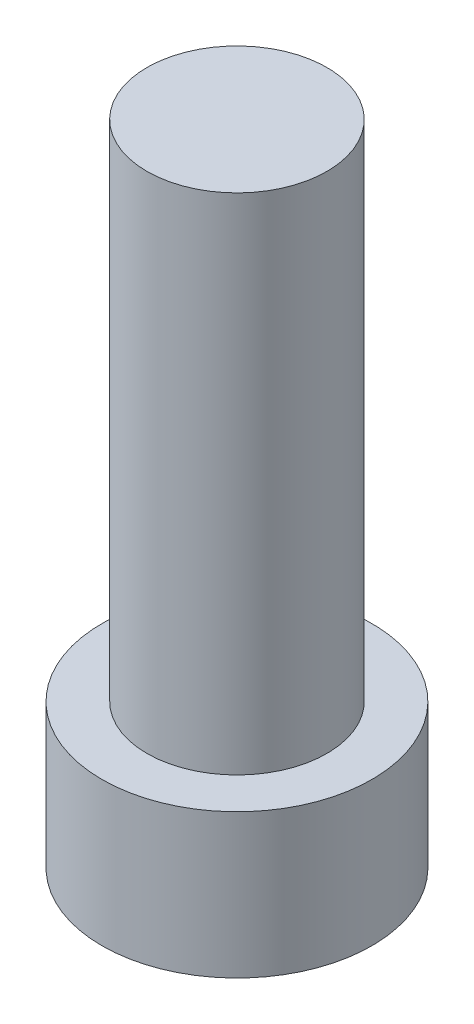
ISO-10303-21;
HEADER;
FILE_DESCRIPTION(('STEP AP214'),'2;1');
FILE_NAME('part.step','',(''),(''),'','','');
FILE_SCHEMA(('AUTOMOTIVE_DESIGN { 1 0 10303 214 1 1 1 1 }'));
ENDSEC;
DATA;
#1=APPLICATION_CONTEXT('core data for automotive mechanical design processes');
#2=APPLICATION_PROTOCOL_DEFINITION('international standard','automotive_design',2000,#1);
#3=PRODUCT_CONTEXT('',#1,'mechanical');
#4=PRODUCT('Part','Part','',(#3));
#5=PRODUCT_RELATED_PRODUCT_CATEGORY('part','',(#4));
#6=PRODUCT_DEFINITION_FORMATION('','',#4);
#7=PRODUCT_DEFINITION_CONTEXT('part definition',#1,'design');
#8=PRODUCT_DEFINITION('design','',#6,#7);
#9=PRODUCT_DEFINITION_SHAPE('','',#8);
#10=(LENGTH_UNIT() NAMED_UNIT(*) SI_UNIT(.MILLI.,.METRE.));
#11=(NAMED_UNIT(*) PLANE_ANGLE_UNIT() SI_UNIT($,.RADIAN.));
#12=(NAMED_UNIT(*) SI_UNIT($,.STERADIAN.) SOLID_ANGLE_UNIT());
#13=UNCERTAINTY_MEASURE_WITH_UNIT(LENGTH_MEASURE(1.E-05),#10,'distance_accuracy_value','');
#14=(GEOMETRIC_REPRESENTATION_CONTEXT(3) GLOBAL_UNCERTAINTY_ASSIGNED_CONTEXT((#13)) GLOBAL_UNIT_ASSIGNED_CONTEXT((#10,
#11,#12)) REPRESENTATION_CONTEXT('',''));
#15=CARTESIAN_POINT('',(0.,0.,0.));
#16=DIRECTION('',(0.,0.,1.));
#17=DIRECTION('',(1.,0.,0.));
#18=AXIS2_PLACEMENT_3D('',#15,#16,#17);
#19=CARTESIAN_POINT('',(0.,4.,0.));
#20=DIRECTION('',(0.,-1.,0.));
#21=DIRECTION('',(0.,0.,-1.));
#22=AXIS2_PLACEMENT_3D('',#19,#20,#21);
#23=CYLINDRICAL_SURFACE('',#22,3.75);
#24=CARTESIAN_POINT('',(0.,4.,0.));
#25=DIRECTION('',(0.,1.,0.));
#26=DIRECTION('',(0.,0.,1.));
#27=AXIS2_PLACEMENT_3D('',#24,#25,#26);
#28=CIRCLE('',#27,3.75);
#29=CARTESIAN_POINT('',(0.,4.,3.75));
#30=VERTEX_POINT('',#29);
#31=EDGE_CURVE('E161',#30,#30,#28,.T.);
#32=ORIENTED_EDGE('',*,*,#31,.F.);
#33=EDGE_LOOP('',(#32));
#34=FACE_BOUND('',#33,.T.);
#35=CARTESIAN_POINT('',(0.,0.,0.));
#36=DIRECTION('',(0.,1.,0.));
#37=DIRECTION('',(0.,0.,1.));
#38=AXIS2_PLACEMENT_3D('',#35,#36,#37);
#39=CIRCLE('',#38,3.75);
#40=CARTESIAN_POINT('',(0.,0.,3.75));
#41=VERTEX_POINT('',#40);
#42=EDGE_CURVE('E156',#41,#41,#39,.T.);
#43=ORIENTED_EDGE('',*,*,#42,.T.);
#44=EDGE_LOOP('',(#43));
#45=FACE_BOUND('',#44,.T.);
#46=ADVANCED_FACE('F39',(#34,#45),#23,.T.);
#47=CARTESIAN_POINT('',(0.,4.,0.));
#48=DIRECTION('',(0.,1.,0.));
#49=DIRECTION('',(0.,0.,1.));
#50=AXIS2_PLACEMENT_3D('',#47,#48,#49);
#51=PLANE('',#50);
#52=CARTESIAN_POINT('',(0.,4.,0.));
#53=DIRECTION('',(0.,1.,0.));
#54=DIRECTION('',(0.,0.,1.));
#55=AXIS2_PLACEMENT_3D('',#52,#53,#54);
#56=CIRCLE('',#55,2.5);
#57=CARTESIAN_POINT('',(0.,4.,2.5));
#58=VERTEX_POINT('',#57);
#59=EDGE_CURVE('E157',#58,#58,#56,.T.);
#60=ORIENTED_EDGE('',*,*,#59,.F.);
#61=EDGE_LOOP('',(#60));
#62=FACE_BOUND('',#61,.T.);
#63=ORIENTED_EDGE('',*,*,#31,.T.);
#64=EDGE_LOOP('',(#63));
#65=FACE_BOUND('',#64,.T.);
#66=ADVANCED_FACE('F244',(#62,#65),#51,.T.);
#67=CARTESIAN_POINT('',(0.,0.,0.));
#68=DIRECTION('',(0.,1.,0.));
#69=DIRECTION('',(0.,0.,1.));
#70=AXIS2_PLACEMENT_3D('',#67,#68,#69);
#71=PLANE('',#70);
#72=DIRECTION('',(0.999992303846242,0.,0.00392329558971804));
#73=VECTOR('',#72,1.);
#74=CARTESIAN_POINT('',(0.00888657905015013,0.,-2.26506273984572));
#75=LINE('',#74,#73);
#76=CARTESIAN_POINT('',(1.31662116163147,0.,-2.25993207103894));
#77=VERTEX_POINT('',#76);
#78=CARTESIAN_POINT('',(-1.29884800353117,0.,-2.2701934086525));
#79=VERTEX_POINT('',#78);
#80=EDGE_CURVE('E176',#77,#79,#75,.F.);
#81=ORIENTED_EDGE('',*,*,#80,.T.);
#82=DIRECTION('',(0.503393825570373,0.,-0.864057090924914));
#83=VECTOR('',#82,1.);
#84=CARTESIAN_POINT('',(-1.9571585843469,0.,-1.14022737313303));
#85=LINE('',#84,#83);
#86=CARTESIAN_POINT('',(-2.61546916516264,0.,-0.0102613376135585));
#87=VERTEX_POINT('',#86);
#88=EDGE_CURVE('E178',#79,#87,#85,.F.);
#89=ORIENTED_EDGE('',*,*,#88,.T.);
#90=DIRECTION('',(-0.49659847827587,0.,-0.867980386514632));
#91=VECTOR('',#90,1.);
#92=CARTESIAN_POINT('',(-1.96604516339705,0.,1.12483536671269));
#93=LINE('',#92,#91);
#94=CARTESIAN_POINT('',(-1.31662116163147,0.,2.25993207103894));
#95=VERTEX_POINT('',#94);
#96=EDGE_CURVE('E170',#87,#95,#93,.F.);
#97=ORIENTED_EDGE('',*,*,#96,.T.);
#98=DIRECTION('',(-0.999992303846242,0.,-0.00392329558971804));
#99=VECTOR('',#98,1.);
#100=CARTESIAN_POINT('',(-0.00888657905015013,0.,2.26506273984572));
#101=LINE('',#100,#99);
#102=CARTESIAN_POINT('',(1.29884800353117,0.,2.2701934086525));
#103=VERTEX_POINT('',#102);
#104=EDGE_CURVE('E168',#95,#103,#101,.F.);
#105=ORIENTED_EDGE('',*,*,#104,.T.);
#106=DIRECTION('',(-0.503393825570373,0.,0.864057090924914));
#107=VECTOR('',#106,1.);
#108=CARTESIAN_POINT('',(1.9571585843469,0.,1.14022737313303));
#109=LINE('',#108,#107);
#110=CARTESIAN_POINT('',(2.61546916516264,0.,0.0102613376135581));
#111=VERTEX_POINT('',#110);
#112=EDGE_CURVE('E172',#103,#111,#109,.F.);
#113=ORIENTED_EDGE('',*,*,#112,.T.);
#114=DIRECTION('',(0.49659847827587,0.,0.867980386514632));
#115=VECTOR('',#114,1.);
#116=CARTESIAN_POINT('',(1.96604516339705,0.,-1.12483536671269));
#117=LINE('',#116,#115);
#118=EDGE_CURVE('E174',#111,#77,#117,.F.);
#119=ORIENTED_EDGE('',*,*,#118,.T.);
#120=EDGE_LOOP('',(#81,#89,#97,#105,#113,#119));
#121=FACE_BOUND('',#120,.T.);
#122=ORIENTED_EDGE('',*,*,#42,.F.);
#123=EDGE_LOOP('',(#122));
#124=FACE_BOUND('',#123,.T.);
#125=ADVANCED_FACE('F232',(#121,#124),#71,.F.);
#126=CARTESIAN_POINT('',(0.,18.,0.));
#127=DIRECTION('',(0.,-1.,0.));
#128=DIRECTION('',(0.,0.,-1.));
#129=AXIS2_PLACEMENT_3D('',#126,#127,#128);
#130=CYLINDRICAL_SURFACE('',#129,2.5);
#131=CARTESIAN_POINT('',(0.,18.,0.));
#132=DIRECTION('',(0.,1.,0.));
#133=DIRECTION('',(0.,0.,1.));
#134=AXIS2_PLACEMENT_3D('',#131,#132,#133);
#135=CIRCLE('',#134,2.5);
#136=CARTESIAN_POINT('',(0.,18.,2.5));
#137=VERTEX_POINT('',#136);
#138=EDGE_CURVE('E143',#137,#137,#135,.T.);
#139=ORIENTED_EDGE('',*,*,#138,.F.);
#140=EDGE_LOOP('',(#139));
#141=FACE_BOUND('',#140,.T.);
#142=ORIENTED_EDGE('',*,*,#59,.T.);
#143=EDGE_LOOP('',(#142));
#144=FACE_BOUND('',#143,.T.);
#145=ADVANCED_FACE('F255',(#141,#144),#130,.T.);
#146=CARTESIAN_POINT('',(0.,18.,0.));
#147=DIRECTION('',(0.,1.,0.));
#148=DIRECTION('',(0.,0.,1.));
#149=AXIS2_PLACEMENT_3D('',#146,#147,#148);
#150=PLANE('',#149);
#151=ORIENTED_EDGE('',*,*,#138,.T.);
#152=EDGE_LOOP('',(#151));
#153=FACE_BOUND('',#152,.T.);
#154=ADVANCED_FACE('F259',(#153),#150,.T.);
#155=CARTESIAN_POINT('',(2.5,2.5,0.00980831446059129));
#156=DIRECTION('',(0.864057090924914,0.,0.503393825570373));
#157=DIRECTION('',(0.503393825570373,0.,-0.864057090924914));
#158=AXIS2_PLACEMENT_3D('',#155,#156,#157);
#159=PLANE('',#158);
#160=DIRECTION('',(0.,-1.,0.));
#161=VECTOR('',#160,1.);
#162=CARTESIAN_POINT('',(2.5,2.5,0.00980831446059129));
#163=LINE('',#162,#161);
#164=CARTESIAN_POINT('',(2.5,2.5,0.00980831446059129));
#165=VERTEX_POINT('',#164);
#166=CARTESIAN_POINT('',(2.5,0.0999999999999998,0.00980831446059129));
#167=VERTEX_POINT('',#166);
#168=EDGE_CURVE('E141',#165,#167,#163,.T.);
#169=ORIENTED_EDGE('',*,*,#168,.T.);
#170=DIRECTION('',(-0.503393825570373,0.,0.864057090924914));
#171=VECTOR('',#170,1.);
#172=CARTESIAN_POINT('',(2.5,0.0999999999999998,0.00980831446059129));
#173=LINE('',#172,#171);
#174=CARTESIAN_POINT('',(1.24150575050882,0.0999999999999998,2.16996766669139));
#175=VERTEX_POINT('',#174);
#176=EDGE_CURVE('E62',#167,#175,#173,.T.);
#177=ORIENTED_EDGE('',*,*,#176,.T.);
#178=DIRECTION('',(0.,-1.,0.));
#179=VECTOR('',#178,1.);
#180=CARTESIAN_POINT('',(1.24150575050882,2.5,2.16996766669139));
#181=LINE('',#180,#179);
#182=CARTESIAN_POINT('',(1.24150575050882,2.5,2.16996766669139));
#183=VERTEX_POINT('',#182);
#184=EDGE_CURVE('E109',#183,#175,#181,.T.);
#185=ORIENTED_EDGE('',*,*,#184,.F.);
#186=DIRECTION('',(-0.503393825570373,0.,0.864057090924914));
#187=VECTOR('',#186,1.);
#188=CARTESIAN_POINT('',(2.5,2.5,0.00980831446059129));
#189=LINE('',#188,#187);
#190=EDGE_CURVE('E113',#165,#183,#189,.T.);
#191=ORIENTED_EDGE('',*,*,#190,.F.);
#192=EDGE_LOOP('',(#169,#177,#185,#191));
#193=FACE_BOUND('',#192,.T.);
#194=ADVANCED_FACE('F111',(#193),#159,.F.);
#195=CARTESIAN_POINT('',(1.25849424949118,2.5,-2.1601593522308));
#196=DIRECTION('',(0.867980386514632,0.,-0.49659847827587));
#197=DIRECTION('',(-0.49659847827587,0.,-0.867980386514632));
#198=AXIS2_PLACEMENT_3D('',#195,#196,#197);
#199=PLANE('',#198);
#200=DIRECTION('',(0.,-1.,0.));
#201=VECTOR('',#200,1.);
#202=CARTESIAN_POINT('',(1.25849424949118,2.5,-2.1601593522308));
#203=LINE('',#202,#201);
#204=CARTESIAN_POINT('',(1.25849424949118,2.5,-2.1601593522308));
#205=VERTEX_POINT('',#204);
#206=CARTESIAN_POINT('',(1.25849424949118,0.0999999999999998,-2.1601593522308));
#207=VERTEX_POINT('',#206);
#208=EDGE_CURVE('E144',#205,#207,#203,.T.);
#209=ORIENTED_EDGE('',*,*,#208,.T.);
#210=DIRECTION('',(0.49659847827587,0.,0.867980386514632));
#211=VECTOR('',#210,1.);
#212=CARTESIAN_POINT('',(1.25849424949118,0.0999999999999998,-2.1601593522308));
#213=LINE('',#212,#211);
#214=EDGE_CURVE('E183',#207,#167,#213,.T.);
#215=ORIENTED_EDGE('',*,*,#214,.T.);
#216=ORIENTED_EDGE('',*,*,#168,.F.);
#217=DIRECTION('',(0.49659847827587,0.,0.867980386514632));
#218=VECTOR('',#217,1.);
#219=CARTESIAN_POINT('',(1.25849424949118,2.5,-2.1601593522308));
#220=LINE('',#219,#218);
#221=EDGE_CURVE('E117',#205,#165,#220,.T.);
#222=ORIENTED_EDGE('',*,*,#221,.F.);
#223=EDGE_LOOP('',(#209,#215,#216,#222));
#224=FACE_BOUND('',#223,.T.);
#225=ADVANCED_FACE('F223',(#224),#199,.F.);
#226=CARTESIAN_POINT('',(-1.24150575050882,2.5,-2.16996766669139));
#227=DIRECTION('',(0.00392329558971804,0.,-0.999992303846242));
#228=DIRECTION('',(-0.999992303846242,0.,-0.00392329558971804));
#229=AXIS2_PLACEMENT_3D('',#226,#227,#228);
#230=PLANE('',#229);
#231=DIRECTION('',(0.,-1.,0.));
#232=VECTOR('',#231,1.);
#233=CARTESIAN_POINT('',(-1.24150575050882,2.5,-2.16996766669139));
#234=LINE('',#233,#232);
#235=CARTESIAN_POINT('',(-1.24150575050882,2.5,-2.16996766669139));
#236=VERTEX_POINT('',#235);
#237=CARTESIAN_POINT('',(-1.24150575050882,0.0999999999999998,-2.16996766669139));
#238=VERTEX_POINT('',#237);
#239=EDGE_CURVE('E147',#236,#238,#234,.T.);
#240=ORIENTED_EDGE('',*,*,#239,.T.);
#241=DIRECTION('',(0.999992303846242,0.,0.00392329558971804));
#242=VECTOR('',#241,1.);
#243=CARTESIAN_POINT('',(-1.24150575050882,0.0999999999999998,-2.16996766669139));
#244=LINE('',#243,#242);
#245=EDGE_CURVE('E181',#238,#207,#244,.T.);
#246=ORIENTED_EDGE('',*,*,#245,.T.);
#247=ORIENTED_EDGE('',*,*,#208,.F.);
#248=DIRECTION('',(0.999992303846242,0.,0.00392329558971804));
#249=VECTOR('',#248,1.);
#250=CARTESIAN_POINT('',(-1.24150575050882,2.5,-2.16996766669139));
#251=LINE('',#250,#249);
#252=EDGE_CURVE('E138',#236,#205,#251,.T.);
#253=ORIENTED_EDGE('',*,*,#252,.F.);
#254=EDGE_LOOP('',(#240,#246,#247,#253));
#255=FACE_BOUND('',#254,.T.);
#256=ADVANCED_FACE('F224',(#255),#230,.F.);
#257=CARTESIAN_POINT('',(-2.5,2.5,-0.00980831446059174));
#258=DIRECTION('',(-0.864057090924914,0.,-0.503393825570373));
#259=DIRECTION('',(-0.503393825570373,0.,0.864057090924914));
#260=AXIS2_PLACEMENT_3D('',#257,#258,#259);
#261=PLANE('',#260);
#262=DIRECTION('',(0.,-1.,0.));
#263=VECTOR('',#262,1.);
#264=CARTESIAN_POINT('',(-2.5,2.5,-0.00980831446059174));
#265=LINE('',#264,#263);
#266=CARTESIAN_POINT('',(-2.5,2.5,-0.00980831446059174));
#267=VERTEX_POINT('',#266);
#268=CARTESIAN_POINT('',(-2.5,0.0999999999999998,-0.00980831446059174));
#269=VERTEX_POINT('',#268);
#270=EDGE_CURVE('E150',#267,#269,#265,.T.);
#271=ORIENTED_EDGE('',*,*,#270,.T.);
#272=DIRECTION('',(0.503393825570373,0.,-0.864057090924914));
#273=VECTOR('',#272,1.);
#274=CARTESIAN_POINT('',(-2.5,0.0999999999999998,-0.00980831446059174));
#275=LINE('',#274,#273);
#276=EDGE_CURVE('E160',#269,#238,#275,.T.);
#277=ORIENTED_EDGE('',*,*,#276,.T.);
#278=ORIENTED_EDGE('',*,*,#239,.F.);
#279=DIRECTION('',(0.503393825570373,0.,-0.864057090924914));
#280=VECTOR('',#279,1.);
#281=CARTESIAN_POINT('',(-2.5,2.5,-0.00980831446059174));
#282=LINE('',#281,#280);
#283=EDGE_CURVE('E135',#267,#236,#282,.T.);
#284=ORIENTED_EDGE('',*,*,#283,.F.);
#285=EDGE_LOOP('',(#271,#277,#278,#284));
#286=FACE_BOUND('',#285,.T.);
#287=ADVANCED_FACE('F219',(#286),#261,.F.);
#288=CARTESIAN_POINT('',(-1.25849424949118,2.5,2.1601593522308));
#289=DIRECTION('',(-0.867980386514632,0.,0.49659847827587));
#290=DIRECTION('',(0.49659847827587,0.,0.867980386514632));
#291=AXIS2_PLACEMENT_3D('',#288,#289,#290);
#292=PLANE('',#291);
#293=DIRECTION('',(0.,-1.,0.));
#294=VECTOR('',#293,1.);
#295=CARTESIAN_POINT('',(-1.25849424949118,2.5,2.1601593522308));
#296=LINE('',#295,#294);
#297=CARTESIAN_POINT('',(-1.25849424949118,2.5,2.1601593522308));
#298=VERTEX_POINT('',#297);
#299=CARTESIAN_POINT('',(-1.25849424949118,0.0999999999999998,2.1601593522308));
#300=VERTEX_POINT('',#299);
#301=EDGE_CURVE('E116',#298,#300,#296,.T.);
#302=ORIENTED_EDGE('',*,*,#301,.T.);
#303=DIRECTION('',(-0.49659847827587,0.,-0.867980386514632));
#304=VECTOR('',#303,1.);
#305=CARTESIAN_POINT('',(-1.25849424949118,0.0999999999999998,2.1601593522308));
#306=LINE('',#305,#304);
#307=EDGE_CURVE('E48',#300,#269,#306,.T.);
#308=ORIENTED_EDGE('',*,*,#307,.T.);
#309=ORIENTED_EDGE('',*,*,#270,.F.);
#310=DIRECTION('',(-0.49659847827587,0.,-0.867980386514632));
#311=VECTOR('',#310,1.);
#312=CARTESIAN_POINT('',(-1.25849424949118,2.5,2.1601593522308));
#313=LINE('',#312,#311);
#314=EDGE_CURVE('E125',#298,#267,#313,.T.);
#315=ORIENTED_EDGE('',*,*,#314,.F.);
#316=EDGE_LOOP('',(#302,#308,#309,#315));
#317=FACE_BOUND('',#316,.T.);
#318=ADVANCED_FACE('F216',(#317),#292,.F.);
#319=CARTESIAN_POINT('',(1.24150575050882,2.5,2.16996766669139));
#320=DIRECTION('',(-0.00392329558971804,0.,0.999992303846242));
#321=DIRECTION('',(0.999992303846242,0.,0.00392329558971804));
#322=AXIS2_PLACEMENT_3D('',#319,#320,#321);
#323=PLANE('',#322);
#324=ORIENTED_EDGE('',*,*,#184,.T.);
#325=DIRECTION('',(-0.999992303846242,0.,-0.00392329558971804));
#326=VECTOR('',#325,1.);
#327=CARTESIAN_POINT('',(1.24150575050882,0.0999999999999998,2.16996766669139));
#328=LINE('',#327,#326);
#329=EDGE_CURVE('E11',#175,#300,#328,.T.);
#330=ORIENTED_EDGE('',*,*,#329,.T.);
#331=ORIENTED_EDGE('',*,*,#301,.F.);
#332=DIRECTION('',(-0.999992303846242,0.,-0.00392329558971804));
#333=VECTOR('',#332,1.);
#334=CARTESIAN_POINT('',(1.24150575050882,2.5,2.16996766669139));
#335=LINE('',#334,#333);
#336=EDGE_CURVE('E120',#183,#298,#335,.T.);
#337=ORIENTED_EDGE('',*,*,#336,.F.);
#338=EDGE_LOOP('',(#324,#330,#331,#337));
#339=FACE_BOUND('',#338,.T.);
#340=ADVANCED_FACE('F121',(#339),#323,.F.);
#341=CARTESIAN_POINT('',(0.,2.5,0.));
#342=DIRECTION('',(0.,-1.,0.));
#343=DIRECTION('',(0.,0.,-1.));
#344=AXIS2_PLACEMENT_3D('',#341,#342,#343);
#345=PLANE('',#344);
#346=ORIENTED_EDGE('',*,*,#190,.T.);
#347=ORIENTED_EDGE('',*,*,#336,.T.);
#348=ORIENTED_EDGE('',*,*,#314,.T.);
#349=ORIENTED_EDGE('',*,*,#283,.T.);
#350=ORIENTED_EDGE('',*,*,#252,.T.);
#351=ORIENTED_EDGE('',*,*,#221,.T.);
#352=EDGE_LOOP('',(#346,#347,#348,#349,#350,#351));
#353=FACE_BOUND('',#352,.T.);
#354=ADVANCED_FACE('F127',(#353),#345,.T.);
#355=CARTESIAN_POINT('',(2.58640570909249,0.0999999999999998,0.0601476970176286));
#356=DIRECTION('',(-0.503393825570373,0.,0.864057090924914));
#357=DIRECTION('',(0.864057090924914,0.,0.503393825570373));
#358=AXIS2_PLACEMENT_3D('',#355,#356,#357);
#359=CYLINDRICAL_SURFACE('',#358,0.1);
#360=CARTESIAN_POINT('',(2.61546916516264,0.0999999999999998,0.0102613376135576));
#361=DIRECTION('',(-0.0039232955897182,0.,0.999992303846242));
#362=DIRECTION('',(0.999992303846243,0.,0.00392329558971816));
#363=AXIS2_PLACEMENT_3D('',#360,#361,#362);
#364=ELLIPSE('',#363,0.115470053837925,0.1);
#365=EDGE_CURVE('E132',#111,#167,#364,.F.);
#366=ORIENTED_EDGE('',*,*,#365,.F.);
#367=ORIENTED_EDGE('',*,*,#112,.F.);
#368=CARTESIAN_POINT('',(1.29884800353117,0.0999999999999998,2.2701934086525));
#369=DIRECTION('',(-0.867980386514632,0.,0.49659847827587));
#370=DIRECTION('',(0.49659847827587,0.,0.867980386514632));
#371=AXIS2_PLACEMENT_3D('',#368,#369,#370);
#372=ELLIPSE('',#371,0.115470053837925,0.1);
#373=EDGE_CURVE('E43',#175,#103,#372,.T.);
#374=ORIENTED_EDGE('',*,*,#373,.F.);
#375=ORIENTED_EDGE('',*,*,#176,.F.);
#376=EDGE_LOOP('',(#366,#367,#374,#375));
#377=FACE_BOUND('',#376,.T.);
#378=ADVANCED_FACE('F41',(#377),#359,.T.);
#379=CARTESIAN_POINT('',(1.24111342094985,0.0999999999999998,2.26996689707602));
#380=DIRECTION('',(-0.999992303846242,0.,-0.00392329558971804));
#381=DIRECTION('',(-0.00392329558971804,0.,0.999992303846242));
#382=AXIS2_PLACEMENT_3D('',#379,#380,#381);
#383=CYLINDRICAL_SURFACE('',#382,0.1);
#384=ORIENTED_EDGE('',*,*,#373,.T.);
#385=ORIENTED_EDGE('',*,*,#104,.F.);
#386=CARTESIAN_POINT('',(-1.31662116163147,0.0999999999999998,2.25993207103894));
#387=DIRECTION('',(-0.864057090924914,0.,-0.503393825570373));
#388=DIRECTION('',(0.503393825570373,0.,-0.864057090924914));
#389=AXIS2_PLACEMENT_3D('',#386,#387,#388);
#390=ELLIPSE('',#389,0.115470053837925,0.1);
#391=EDGE_CURVE('E194',#300,#95,#390,.T.);
#392=ORIENTED_EDGE('',*,*,#391,.F.);
#393=ORIENTED_EDGE('',*,*,#329,.F.);
#394=EDGE_LOOP('',(#384,#385,#392,#393));
#395=FACE_BOUND('',#394,.T.);
#396=ADVANCED_FACE('F208',(#395),#383,.T.);
#397=CARTESIAN_POINT('',(1.34529228814264,0.0999999999999998,-2.20981920005839));
#398=DIRECTION('',(0.49659847827587,0.,0.867980386514632));
#399=DIRECTION('',(0.867980386514632,0.,-0.49659847827587));
#400=AXIS2_PLACEMENT_3D('',#397,#398,#399);
#401=CYLINDRICAL_SURFACE('',#400,0.1);
#402=ORIENTED_EDGE('',*,*,#365,.T.);
#403=ORIENTED_EDGE('',*,*,#214,.F.);
#404=CARTESIAN_POINT('',(1.31662116163147,0.0999999999999998,-2.25993207103894));
#405=DIRECTION('',(0.864057090924914,0.,0.503393825570373));
#406=DIRECTION('',(0.503393825570373,0.,-0.864057090924914));
#407=AXIS2_PLACEMENT_3D('',#404,#405,#406);
#408=ELLIPSE('',#407,0.115470053837925,0.1);
#409=EDGE_CURVE('E191',#77,#207,#408,.F.);
#410=ORIENTED_EDGE('',*,*,#409,.F.);
#411=ORIENTED_EDGE('',*,*,#118,.F.);
#412=EDGE_LOOP('',(#402,#403,#410,#411));
#413=FACE_BOUND('',#412,.T.);
#414=ADVANCED_FACE('F201',(#413),#401,.T.);
#415=CARTESIAN_POINT('',(-1.34529228814264,0.0999999999999998,2.20981920005839));
#416=DIRECTION('',(-0.49659847827587,0.,-0.867980386514632));
#417=DIRECTION('',(-0.867980386514632,0.,0.49659847827587));
#418=AXIS2_PLACEMENT_3D('',#415,#416,#417);
#419=CYLINDRICAL_SURFACE('',#418,0.1);
#420=ORIENTED_EDGE('',*,*,#391,.T.);
#421=ORIENTED_EDGE('',*,*,#96,.F.);
#422=CARTESIAN_POINT('',(-2.61546916516264,0.0999999999999998,-0.0102613376135587));
#423=DIRECTION('',(0.00392329558971826,0.,-0.999992303846242));
#424=DIRECTION('',(0.999992303846242,0.,0.00392329558971816));
#425=AXIS2_PLACEMENT_3D('',#422,#423,#424);
#426=ELLIPSE('',#425,0.115470053837925,0.1);
#427=EDGE_CURVE('E189',#269,#87,#426,.T.);
#428=ORIENTED_EDGE('',*,*,#427,.F.);
#429=ORIENTED_EDGE('',*,*,#307,.F.);
#430=EDGE_LOOP('',(#420,#421,#428,#429));
#431=FACE_BOUND('',#430,.T.);
#432=ADVANCED_FACE('F213',(#431),#419,.T.);
#433=CARTESIAN_POINT('',(-1.24111342094985,0.0999999999999998,-2.26996689707602));
#434=DIRECTION('',(0.999992303846242,0.,0.00392329558971804));
#435=DIRECTION('',(0.00392329558971804,0.,-0.999992303846242));
#436=AXIS2_PLACEMENT_3D('',#433,#434,#435);
#437=CYLINDRICAL_SURFACE('',#436,0.1);
#438=ORIENTED_EDGE('',*,*,#409,.T.);
#439=ORIENTED_EDGE('',*,*,#245,.F.);
#440=CARTESIAN_POINT('',(-1.29884800353117,0.0999999999999998,-2.2701934086525));
#441=DIRECTION('',(0.867980386514632,0.,-0.49659847827587));
#442=DIRECTION('',(-0.49659847827587,0.,-0.867980386514632));
#443=AXIS2_PLACEMENT_3D('',#440,#441,#442);
#444=ELLIPSE('',#443,0.115470053837925,0.1);
#445=EDGE_CURVE('E187',#79,#238,#444,.F.);
#446=ORIENTED_EDGE('',*,*,#445,.F.);
#447=ORIENTED_EDGE('',*,*,#80,.F.);
#448=EDGE_LOOP('',(#438,#439,#446,#447));
#449=FACE_BOUND('',#448,.T.);
#450=ADVANCED_FACE('F228',(#449),#437,.T.);
#451=CARTESIAN_POINT('',(-2.58640570909249,0.0999999999999998,-0.060147697017629));
#452=DIRECTION('',(0.503393825570373,0.,-0.864057090924914));
#453=DIRECTION('',(-0.864057090924914,0.,-0.503393825570373));
#454=AXIS2_PLACEMENT_3D('',#451,#452,#453);
#455=CYLINDRICAL_SURFACE('',#454,0.1);
#456=ORIENTED_EDGE('',*,*,#427,.T.);
#457=ORIENTED_EDGE('',*,*,#88,.F.);
#458=ORIENTED_EDGE('',*,*,#445,.T.);
#459=ORIENTED_EDGE('',*,*,#276,.F.);
#460=EDGE_LOOP('',(#456,#457,#458,#459));
#461=FACE_BOUND('',#460,.T.);
#462=ADVANCED_FACE('F235',(#461),#455,.T.);
#463=CLOSED_SHELL('',(#46,#66,#125,#145,#154,#194,#225,#256,#287,#318,#340,#354,#378,#396,#414,
#432,#450,#462));
#464=MANIFOLD_SOLID_BREP('B2',#463);
#465=ADVANCED_BREP_SHAPE_REPRESENTATION('',(#18,#464),#14);
#466=SHAPE_DEFINITION_REPRESENTATION(#9,#465);
ENDSEC;
END-ISO-10303-21;
